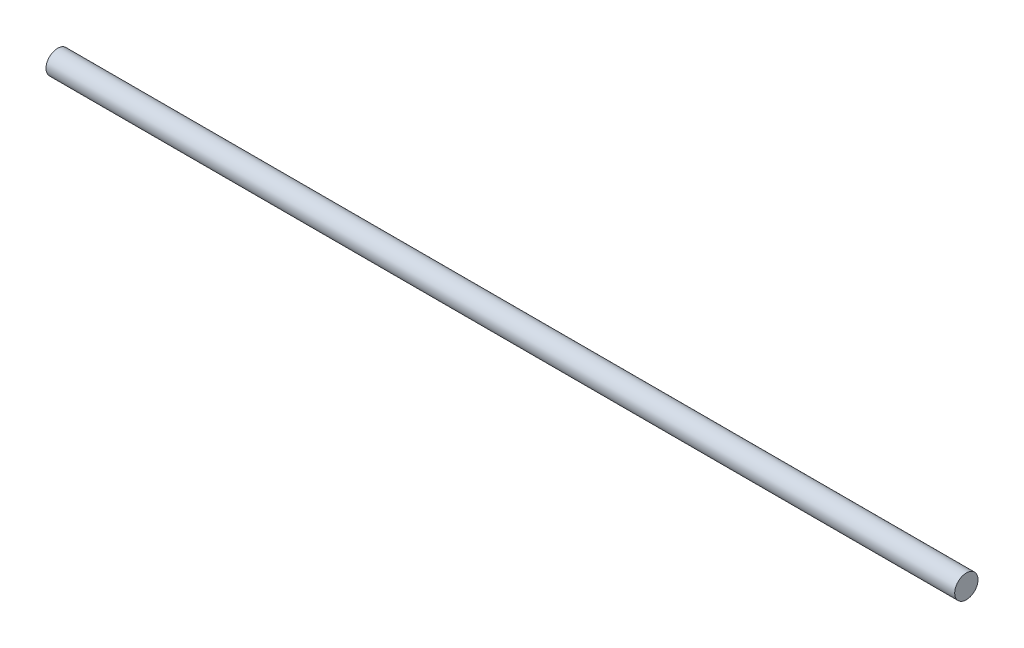
ISO-10303-21;
HEADER;
FILE_DESCRIPTION(('STEP AP214'),'2;1');
FILE_NAME('part.step','',(''),(''),'','','');
FILE_SCHEMA(('AUTOMOTIVE_DESIGN { 1 0 10303 214 1 1 1 1 }'));
ENDSEC;
DATA;
#1=APPLICATION_CONTEXT('core data for automotive mechanical design processes');
#2=APPLICATION_PROTOCOL_DEFINITION('international standard','automotive_design',2000,#1);
#3=PRODUCT_CONTEXT('',#1,'mechanical');
#4=PRODUCT('Part','Part','',(#3));
#5=PRODUCT_RELATED_PRODUCT_CATEGORY('part','',(#4));
#6=PRODUCT_DEFINITION_FORMATION('','',#4);
#7=PRODUCT_DEFINITION_CONTEXT('part definition',#1,'design');
#8=PRODUCT_DEFINITION('design','',#6,#7);
#9=PRODUCT_DEFINITION_SHAPE('','',#8);
#10=(LENGTH_UNIT() NAMED_UNIT(*) SI_UNIT(.MILLI.,.METRE.));
#11=(NAMED_UNIT(*) PLANE_ANGLE_UNIT() SI_UNIT($,.RADIAN.));
#12=(NAMED_UNIT(*) SI_UNIT($,.STERADIAN.) SOLID_ANGLE_UNIT());
#13=UNCERTAINTY_MEASURE_WITH_UNIT(LENGTH_MEASURE(1.E-05),#10,'distance_accuracy_value','');
#14=(GEOMETRIC_REPRESENTATION_CONTEXT(3) GLOBAL_UNCERTAINTY_ASSIGNED_CONTEXT((#13)) GLOBAL_UNIT_ASSIGNED_CONTEXT((#10,
#11,#12)) REPRESENTATION_CONTEXT('',''));
#15=CARTESIAN_POINT('',(0.,0.,0.));
#16=DIRECTION('',(0.,0.,1.));
#17=DIRECTION('',(1.,0.,0.));
#18=AXIS2_PLACEMENT_3D('',#15,#16,#17);
#19=CARTESIAN_POINT('',(390.,0.,0.));
#20=DIRECTION('',(-1.,0.,0.));
#21=DIRECTION('',(0.,0.,1.));
#22=AXIS2_PLACEMENT_3D('',#19,#20,#21);
#23=CYLINDRICAL_SURFACE('',#22,5.);
#24=CARTESIAN_POINT('',(390.,0.,0.));
#25=DIRECTION('',(1.,0.,0.));
#26=DIRECTION('',(0.,0.,-1.));
#27=AXIS2_PLACEMENT_3D('',#24,#25,#26);
#28=CIRCLE('',#27,5.);
#29=CARTESIAN_POINT('',(390.,0.,-5.));
#30=VERTEX_POINT('',#29);
#31=EDGE_CURVE('E10',#30,#30,#28,.T.);
#32=ORIENTED_EDGE('',*,*,#31,.F.);
#33=EDGE_LOOP('',(#32));
#34=FACE_BOUND('',#33,.T.);
#35=CARTESIAN_POINT('',(0.,0.,0.));
#36=DIRECTION('',(1.,0.,0.));
#37=DIRECTION('',(0.,0.,-1.));
#38=AXIS2_PLACEMENT_3D('',#35,#36,#37);
#39=CIRCLE('',#38,5.);
#40=CARTESIAN_POINT('',(0.,0.,-5.));
#41=VERTEX_POINT('',#40);
#42=EDGE_CURVE('E44',#41,#41,#39,.T.);
#43=ORIENTED_EDGE('',*,*,#42,.T.);
#44=EDGE_LOOP('',(#43));
#45=FACE_BOUND('',#44,.T.);
#46=ADVANCED_FACE('F41',(#34,#45),#23,.T.);
#47=CARTESIAN_POINT('',(390.,0.,0.));
#48=DIRECTION('',(1.,0.,0.));
#49=DIRECTION('',(0.,0.,-1.));
#50=AXIS2_PLACEMENT_3D('',#47,#48,#49);
#51=PLANE('',#50);
#52=ORIENTED_EDGE('',*,*,#31,.T.);
#53=EDGE_LOOP('',(#52));
#54=FACE_BOUND('',#53,.T.);
#55=ADVANCED_FACE('F58',(#54),#51,.T.);
#56=CARTESIAN_POINT('',(0.,0.,0.));
#57=DIRECTION('',(1.,0.,0.));
#58=DIRECTION('',(0.,0.,-1.));
#59=AXIS2_PLACEMENT_3D('',#56,#57,#58);
#60=PLANE('',#59);
#61=ORIENTED_EDGE('',*,*,#42,.F.);
#62=EDGE_LOOP('',(#61));
#63=FACE_BOUND('',#62,.T.);
#64=ADVANCED_FACE('F56',(#63),#60,.F.);
#65=CLOSED_SHELL('',(#46,#55,#64));
#66=MANIFOLD_SOLID_BREP('B2',#65);
#67=ADVANCED_BREP_SHAPE_REPRESENTATION('',(#18,#66),#14);
#68=SHAPE_DEFINITION_REPRESENTATION(#9,#67);
ENDSEC;
END-ISO-10303-21;
